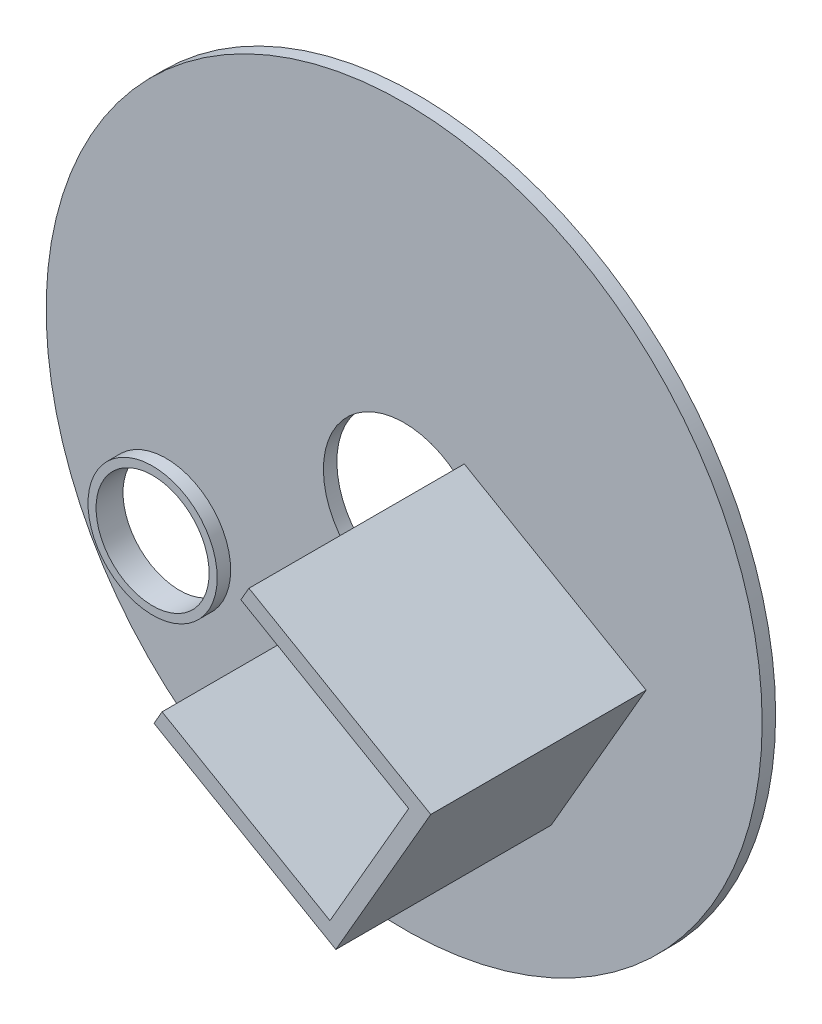
ISO-10303-21;
HEADER;
FILE_DESCRIPTION(('STEP AP214'),'2;1');
FILE_NAME('part.step','',(''),(''),'','','');
FILE_SCHEMA(('AUTOMOTIVE_DESIGN { 1 0 10303 214 1 1 1 1 }'));
ENDSEC;
DATA;
#1=APPLICATION_CONTEXT('core data for automotive mechanical design processes');
#2=APPLICATION_PROTOCOL_DEFINITION('international standard','automotive_design',2000,#1);
#3=PRODUCT_CONTEXT('',#1,'mechanical');
#4=PRODUCT('Part','Part','',(#3));
#5=PRODUCT_RELATED_PRODUCT_CATEGORY('part','',(#4));
#6=PRODUCT_DEFINITION_FORMATION('','',#4);
#7=PRODUCT_DEFINITION_CONTEXT('part definition',#1,'design');
#8=PRODUCT_DEFINITION('design','',#6,#7);
#9=PRODUCT_DEFINITION_SHAPE('','',#8);
#10=(LENGTH_UNIT() NAMED_UNIT(*) SI_UNIT(.MILLI.,.METRE.));
#11=(NAMED_UNIT(*) PLANE_ANGLE_UNIT() SI_UNIT($,.RADIAN.));
#12=(NAMED_UNIT(*) SI_UNIT($,.STERADIAN.) SOLID_ANGLE_UNIT());
#13=UNCERTAINTY_MEASURE_WITH_UNIT(LENGTH_MEASURE(1.E-05),#10,'distance_accuracy_value','');
#14=(GEOMETRIC_REPRESENTATION_CONTEXT(3) GLOBAL_UNCERTAINTY_ASSIGNED_CONTEXT((#13)) GLOBAL_UNIT_ASSIGNED_CONTEXT((#10,
#11,#12)) REPRESENTATION_CONTEXT('',''));
#15=CARTESIAN_POINT('',(0.,0.,0.));
#16=DIRECTION('',(0.,0.,1.));
#17=DIRECTION('',(1.,0.,0.));
#18=AXIS2_PLACEMENT_3D('',#15,#16,#17);
#19=CARTESIAN_POINT('',(0.,0.,2.5));
#20=DIRECTION('',(0.,0.,1.));
#21=DIRECTION('',(1.,0.,0.));
#22=AXIS2_PLACEMENT_3D('',#19,#20,#21);
#23=PLANE('',#22);
#24=DIRECTION('',(0.866025403784439,-0.5,0.));
#25=VECTOR('',#24,1.);
#26=CARTESIAN_POINT('',(7.3348934897823,12.7044081924091,2.5));
#27=LINE('',#26,#25);
#28=CARTESIAN_POINT('',(10.0456152535654,11.1393722523908,2.5));
#29=VERTEX_POINT('',#28);
#30=CARTESIAN_POINT('',(40.8448515283427,-6.64257510168673,2.5));
#31=VERTEX_POINT('',#30);
#32=EDGE_CURVE('E194',#29,#31,#27,.T.);
#33=ORIENTED_EDGE('',*,*,#32,.F.);
#34=CARTESIAN_POINT('',(0.,0.,2.5));
#35=DIRECTION('',(0.,0.,1.));
#36=DIRECTION('',(1.,0.,0.));
#37=AXIS2_PLACEMENT_3D('',#34,#35,#36);
#38=CIRCLE('',#37,15.);
#39=CARTESIAN_POINT('',(-4.32006711485053,-14.3644359486611,2.5));
#40=VERTEX_POINT('',#39);
#41=EDGE_CURVE('E215',#40,#29,#38,.T.);
#42=ORIENTED_EDGE('',*,*,#41,.F.);
#43=DIRECTION('',(-0.866025403784439,0.5,0.));
#44=VECTOR('',#43,1.);
#45=CARTESIAN_POINT('',(-7.30000000000009,-12.643970895253,2.5));
#46=LINE('',#45,#44);
#47=CARTESIAN_POINT('',(26.2099580385602,-31.9909541893488,2.5));
#48=VERTEX_POINT('',#47);
#49=EDGE_CURVE('E192',#48,#40,#46,.T.);
#50=ORIENTED_EDGE('',*,*,#49,.F.);
#51=DIRECTION('',(-0.500000000000004,-0.866025403784436,0.));
#52=VECTOR('',#51,1.);
#53=CARTESIAN_POINT('',(33.5099580385602,-19.3469832940961,2.5));
#54=LINE('',#53,#52);
#55=EDGE_CURVE('E202',#31,#48,#54,.T.);
#56=ORIENTED_EDGE('',*,*,#55,.F.);
#57=EDGE_LOOP('',(#33,#42,#50,#56));
#58=FACE_BOUND('',#57,.T.);
#59=ADVANCED_FACE('F34',(#58),#23,.T.);
#60=CARTESIAN_POINT('',(0.,0.,2.5));
#61=DIRECTION('',(0.,0.,-1.));
#62=DIRECTION('',(-1.,0.,0.));
#63=AXIS2_PLACEMENT_3D('',#60,#61,#62);
#64=CYLINDRICAL_SURFACE('',#63,15.);
#65=DIRECTION('',(0.,0.,-1.));
#66=VECTOR('',#65,1.);
#67=CARTESIAN_POINT('',(9.71109446483266,11.4321758338077,2.5));
#68=LINE('',#67,#66);
#69=CARTESIAN_POINT('',(9.71109446483266,11.4321758338077,2.5));
#70=VERTEX_POINT('',#69);
#71=CARTESIAN_POINT('',(9.71109446483266,11.4321758338077,0.));
#72=VERTEX_POINT('',#71);
#73=EDGE_CURVE('E11',#70,#72,#68,.T.);
#74=ORIENTED_EDGE('',*,*,#73,.F.);
#75=CARTESIAN_POINT('',(-5.04500746019167,-14.1261424219994,2.5));
#76=VERTEX_POINT('',#75);
#77=EDGE_CURVE('E218',#70,#76,#38,.T.);
#78=ORIENTED_EDGE('',*,*,#77,.T.);
#79=DIRECTION('',(0.,0.,-1.));
#80=VECTOR('',#79,1.);
#81=CARTESIAN_POINT('',(-5.04500746019167,-14.1261424219994,2.5));
#82=LINE('',#81,#80);
#83=CARTESIAN_POINT('',(-5.04500746019167,-14.1261424219994,0.));
#84=VERTEX_POINT('',#83);
#85=EDGE_CURVE('E225',#84,#76,#82,.F.);
#86=ORIENTED_EDGE('',*,*,#85,.F.);
#87=CARTESIAN_POINT('',(0.,0.,0.));
#88=DIRECTION('',(0.,0.,1.));
#89=DIRECTION('',(1.,0.,0.));
#90=AXIS2_PLACEMENT_3D('',#87,#88,#89);
#91=CIRCLE('',#90,15.);
#92=EDGE_CURVE('E219',#72,#84,#91,.T.);
#93=ORIENTED_EDGE('',*,*,#92,.F.);
#94=EDGE_LOOP('',(#74,#78,#86,#93));
#95=FACE_BOUND('',#94,.T.);
#96=ADVANCED_FACE('F267',(#95),#64,.F.);
#97=DIRECTION('',(-0.499999999999999,-0.866025403784439,0.));
#98=VECTOR('',#97,1.);
#99=CARTESIAN_POINT('',(2.33304350232051,-1.34698329409585,2.5));
#100=LINE('',#99,#98);
#101=CARTESIAN_POINT('',(11.1673369921028,13.9544618791821,2.5));
#102=VERTEX_POINT('',#101);
#103=EDGE_CURVE('E196',#102,#70,#100,.T.);
#104=ORIENTED_EDGE('',*,*,#103,.F.);
#105=DIRECTION('',(0.866025403784439,-0.5,0.));
#106=VECTOR('',#105,1.);
#107=CARTESIAN_POINT('',(8.8342934897823,15.3014451732779,2.5));
#108=LINE('',#107,#106);
#109=CARTESIAN_POINT('',(44.9412885092114,-5.54493812081795,2.5));
#110=VERTEX_POINT('',#109);
#111=EDGE_CURVE('E143',#102,#110,#108,.T.);
#112=ORIENTED_EDGE('',*,*,#111,.T.);
#113=DIRECTION('',(-0.5,-0.866025403784439,0.));
#114=VECTOR('',#113,1.);
#115=CARTESIAN_POINT('',(36.1069950194291,-20.8463832940959,2.5));
#116=LINE('',#115,#114);
#117=CARTESIAN_POINT('',(27.3075950194289,-36.0873911702176,2.5));
#118=VERTEX_POINT('',#117);
#119=EDGE_CURVE('E198',#110,#118,#116,.T.);
#120=ORIENTED_EDGE('',*,*,#119,.T.);
#121=DIRECTION('',(-0.866025403784439,0.5,0.));
#122=VECTOR('',#121,1.);
#123=CARTESIAN_POINT('',(-8.7994000000001,-15.2410078761217,2.5));
#124=LINE('',#123,#122);
#125=CARTESIAN_POINT('',(-6.4663564976796,-16.5879911702176,2.5));
#126=VERTEX_POINT('',#125);
#127=EDGE_CURVE('E57',#118,#126,#124,.T.);
#128=ORIENTED_EDGE('',*,*,#127,.T.);
#129=DIRECTION('',(-0.5,-0.866025403784438,0.));
#130=VECTOR('',#129,1.);
#131=CARTESIAN_POINT('',(2.3330435023205,-1.34698329409585,2.5));
#132=LINE('',#131,#130);
#133=EDGE_CURVE('E146',#76,#126,#132,.T.);
#134=ORIENTED_EDGE('',*,*,#133,.F.);
#135=ORIENTED_EDGE('',*,*,#77,.F.);
#136=EDGE_LOOP('',(#104,#112,#120,#128,#134,#135));
#137=FACE_BOUND('',#136,.T.);
#138=CARTESIAN_POINT('',(0.,0.,2.5));
#139=DIRECTION('',(0.,0.,1.));
#140=DIRECTION('',(1.,0.,0.));
#141=AXIS2_PLACEMENT_3D('',#138,#139,#140);
#142=CIRCLE('',#141,66.5);
#143=CARTESIAN_POINT('',(66.5,0.,2.5));
#144=VERTEX_POINT('',#143);
#145=EDGE_CURVE('E222',#144,#144,#142,.T.);
#146=ORIENTED_EDGE('',*,*,#145,.T.);
#147=EDGE_LOOP('',(#146));
#148=FACE_BOUND('',#147,.T.);
#149=CARTESIAN_POINT('',(-44.2268578187365,-24.8285231119721,2.5));
#150=DIRECTION('',(0.,0.,1.));
#151=DIRECTION('',(1.,0.,0.));
#152=AXIS2_PLACEMENT_3D('',#149,#150,#151);
#153=CIRCLE('',#152,12.);
#154=CARTESIAN_POINT('',(-32.2268578187365,-24.8285231119721,2.5));
#155=VERTEX_POINT('',#154);
#156=EDGE_CURVE('E208',#155,#155,#153,.T.);
#157=ORIENTED_EDGE('',*,*,#156,.F.);
#158=EDGE_LOOP('',(#157));
#159=FACE_BOUND('',#158,.T.);
#160=ADVANCED_FACE('F260',(#137,#148,#159),#23,.T.);
#161=CARTESIAN_POINT('',(0.,0.,0.));
#162=DIRECTION('',(0.,0.,1.));
#163=DIRECTION('',(1.,0.,0.));
#164=AXIS2_PLACEMENT_3D('',#161,#162,#163);
#165=PLANE('',#164);
#166=DIRECTION('',(0.499999999999999,0.866025403784439,0.));
#167=VECTOR('',#166,1.);
#168=CARTESIAN_POINT('',(9.6679369921028,11.3574248983133,0.));
#169=LINE('',#168,#167);
#170=CARTESIAN_POINT('',(9.6679369921028,11.3574248983133,0.));
#171=VERTEX_POINT('',#170);
#172=EDGE_CURVE('E169',#171,#72,#169,.T.);
#173=ORIENTED_EDGE('',*,*,#172,.T.);
#174=ORIENTED_EDGE('',*,*,#92,.T.);
#175=DIRECTION('',(0.5,0.866025403784438,0.));
#176=VECTOR('',#175,1.);
#177=CARTESIAN_POINT('',(-6.4663564976796,-16.5879911702176,0.));
#178=LINE('',#177,#176);
#179=CARTESIAN_POINT('',(-4.9669564976796,-13.9909541893488,0.));
#180=VERTEX_POINT('',#179);
#181=EDGE_CURVE('E137',#84,#180,#178,.T.);
#182=ORIENTED_EDGE('',*,*,#181,.T.);
#183=DIRECTION('',(0.866025403784439,-0.5,0.));
#184=VECTOR('',#183,1.);
#185=CARTESIAN_POINT('',(26.2099580385602,-31.9909541893488,0.));
#186=LINE('',#185,#184);
#187=CARTESIAN_POINT('',(-4.32006711485051,-14.3644359486611,0.));
#188=VERTEX_POINT('',#187);
#189=EDGE_CURVE('E49',#180,#188,#186,.T.);
#190=ORIENTED_EDGE('',*,*,#189,.T.);
#191=CARTESIAN_POINT('',(10.0456152535654,11.1393722523908,0.));
#192=VERTEX_POINT('',#191);
#193=EDGE_CURVE('E220',#188,#192,#91,.T.);
#194=ORIENTED_EDGE('',*,*,#193,.T.);
#195=DIRECTION('',(-0.866025403784439,0.5,0.));
#196=VECTOR('',#195,1.);
#197=CARTESIAN_POINT('',(40.8448515283427,-6.64257510168673,0.));
#198=LINE('',#197,#196);
#199=EDGE_CURVE('E172',#192,#171,#198,.T.);
#200=ORIENTED_EDGE('',*,*,#199,.T.);
#201=EDGE_LOOP('',(#173,#174,#182,#190,#194,#200));
#202=FACE_BOUND('',#201,.T.);
#203=CARTESIAN_POINT('',(-44.2268578187365,-24.8285231119721,0.));
#204=DIRECTION('',(0.,0.,1.));
#205=DIRECTION('',(1.,0.,0.));
#206=AXIS2_PLACEMENT_3D('',#203,#204,#205);
#207=CIRCLE('',#206,10.5);
#208=CARTESIAN_POINT('',(-33.7268578187365,-24.8285231119721,0.));
#209=VERTEX_POINT('',#208);
#210=EDGE_CURVE('E212',#209,#209,#207,.T.);
#211=ORIENTED_EDGE('',*,*,#210,.T.);
#212=EDGE_LOOP('',(#211));
#213=FACE_BOUND('',#212,.T.);
#214=CARTESIAN_POINT('',(0.,0.,0.));
#215=DIRECTION('',(0.,0.,1.));
#216=DIRECTION('',(1.,0.,0.));
#217=AXIS2_PLACEMENT_3D('',#214,#215,#216);
#218=CIRCLE('',#217,66.5);
#219=CARTESIAN_POINT('',(66.5,0.,0.));
#220=VERTEX_POINT('',#219);
#221=EDGE_CURVE('E226',#220,#220,#218,.T.);
#222=ORIENTED_EDGE('',*,*,#221,.F.);
#223=EDGE_LOOP('',(#222));
#224=FACE_BOUND('',#223,.T.);
#225=ADVANCED_FACE('F270',(#202,#213,#224),#165,.F.);
#226=CARTESIAN_POINT('',(0.,0.,2.5));
#227=DIRECTION('',(0.,0.,-1.));
#228=DIRECTION('',(-1.,0.,0.));
#229=AXIS2_PLACEMENT_3D('',#226,#227,#228);
#230=CYLINDRICAL_SURFACE('',#229,66.5);
#231=ORIENTED_EDGE('',*,*,#145,.F.);
#232=EDGE_LOOP('',(#231));
#233=FACE_BOUND('',#232,.T.);
#234=ORIENTED_EDGE('',*,*,#221,.T.);
#235=EDGE_LOOP('',(#234));
#236=FACE_BOUND('',#235,.T.);
#237=ADVANCED_FACE('F36',(#233,#236),#230,.T.);
#238=DIRECTION('',(0.,0.,-1.));
#239=VECTOR('',#238,1.);
#240=CARTESIAN_POINT('',(10.0456152535654,11.1393722523908,2.5));
#241=LINE('',#240,#239);
#242=EDGE_CURVE('E42',#192,#29,#241,.F.);
#243=ORIENTED_EDGE('',*,*,#242,.F.);
#244=ORIENTED_EDGE('',*,*,#193,.F.);
#245=DIRECTION('',(0.,0.,-1.));
#246=VECTOR('',#245,1.);
#247=CARTESIAN_POINT('',(-4.32006711485053,-14.3644359486611,2.5));
#248=LINE('',#247,#246);
#249=EDGE_CURVE('E232',#40,#188,#248,.T.);
#250=ORIENTED_EDGE('',*,*,#249,.F.);
#251=ORIENTED_EDGE('',*,*,#41,.T.);
#252=EDGE_LOOP('',(#243,#244,#250,#251));
#253=FACE_BOUND('',#252,.T.);
#254=ADVANCED_FACE('F244',(#253),#64,.F.);
#255=CARTESIAN_POINT('',(-44.2268578187365,-24.8285231119721,-11.));
#256=DIRECTION('',(0.,0.,1.));
#257=DIRECTION('',(1.,0.,0.));
#258=AXIS2_PLACEMENT_3D('',#255,#256,#257);
#259=CYLINDRICAL_SURFACE('',#258,10.5);
#260=ORIENTED_EDGE('',*,*,#210,.F.);
#261=EDGE_LOOP('',(#260));
#262=FACE_BOUND('',#261,.T.);
#263=CARTESIAN_POINT('',(-44.2268578187365,-24.8285231119721,5.));
#264=DIRECTION('',(0.,0.,1.));
#265=DIRECTION('',(1.,0.,0.));
#266=AXIS2_PLACEMENT_3D('',#263,#264,#265);
#267=CIRCLE('',#266,10.5);
#268=CARTESIAN_POINT('',(-33.7268578187365,-24.8285231119721,5.));
#269=VERTEX_POINT('',#268);
#270=EDGE_CURVE('E205',#269,#269,#267,.T.);
#271=ORIENTED_EDGE('',*,*,#270,.T.);
#272=EDGE_LOOP('',(#271));
#273=FACE_BOUND('',#272,.T.);
#274=ADVANCED_FACE('F282',(#262,#273),#259,.F.);
#275=CARTESIAN_POINT('',(-44.2268578187365,-24.8285231119721,5.));
#276=DIRECTION('',(0.,0.,1.));
#277=DIRECTION('',(1.,0.,0.));
#278=AXIS2_PLACEMENT_3D('',#275,#276,#277);
#279=PLANE('',#278);
#280=CARTESIAN_POINT('',(-44.2268578187365,-24.8285231119721,5.));
#281=DIRECTION('',(0.,0.,1.));
#282=DIRECTION('',(1.,0.,0.));
#283=AXIS2_PLACEMENT_3D('',#280,#281,#282);
#284=CIRCLE('',#283,12.);
#285=CARTESIAN_POINT('',(-32.2268578187365,-24.8285231119721,5.));
#286=VERTEX_POINT('',#285);
#287=EDGE_CURVE('E209',#286,#286,#284,.T.);
#288=ORIENTED_EDGE('',*,*,#287,.T.);
#289=EDGE_LOOP('',(#288));
#290=FACE_BOUND('',#289,.T.);
#291=ORIENTED_EDGE('',*,*,#270,.F.);
#292=EDGE_LOOP('',(#291));
#293=FACE_BOUND('',#292,.T.);
#294=ADVANCED_FACE('F391',(#290,#293),#279,.T.);
#295=CARTESIAN_POINT('',(-44.2268578187365,-24.8285231119721,5.));
#296=DIRECTION('',(0.,0.,-1.));
#297=DIRECTION('',(-1.,0.,0.));
#298=AXIS2_PLACEMENT_3D('',#295,#296,#297);
#299=CYLINDRICAL_SURFACE('',#298,12.);
#300=ORIENTED_EDGE('',*,*,#287,.F.);
#301=EDGE_LOOP('',(#300));
#302=FACE_BOUND('',#301,.T.);
#303=ORIENTED_EDGE('',*,*,#156,.T.);
#304=EDGE_LOOP('',(#303));
#305=FACE_BOUND('',#304,.T.);
#306=ADVANCED_FACE('F319',(#302,#305),#299,.T.);
#307=CARTESIAN_POINT('',(42.3442515283426,-4.04553812081795,42.5));
#308=DIRECTION('',(-0.5,-0.866025403784439,0.));
#309=DIRECTION('',(0.866025403784439,-0.5,0.));
#310=AXIS2_PLACEMENT_3D('',#307,#308,#309);
#311=PLANE('',#310);
#312=ORIENTED_EDGE('',*,*,#111,.F.);
#313=DIRECTION('',(0.,0.,-1.));
#314=VECTOR('',#313,1.);
#315=CARTESIAN_POINT('',(11.1673369921028,13.9544618791821,42.5));
#316=LINE('',#315,#314);
#317=CARTESIAN_POINT('',(11.1673369921028,13.9544618791821,42.5));
#318=VERTEX_POINT('',#317);
#319=EDGE_CURVE('E140',#318,#102,#316,.T.);
#320=ORIENTED_EDGE('',*,*,#319,.F.);
#321=DIRECTION('',(-0.866025403784439,0.5,0.));
#322=VECTOR('',#321,1.);
#323=CARTESIAN_POINT('',(42.3442515283426,-4.04553812081795,42.5));
#324=LINE('',#323,#322);
#325=CARTESIAN_POINT('',(44.9412885092114,-5.54493812081795,42.5));
#326=VERTEX_POINT('',#325);
#327=EDGE_CURVE('E125',#326,#318,#324,.T.);
#328=ORIENTED_EDGE('',*,*,#327,.F.);
#329=DIRECTION('',(0.,0.,-1.));
#330=VECTOR('',#329,1.);
#331=CARTESIAN_POINT('',(44.9412885092114,-5.54493812081795,42.5));
#332=LINE('',#331,#330);
#333=EDGE_CURVE('E168',#326,#110,#332,.T.);
#334=ORIENTED_EDGE('',*,*,#333,.T.);
#335=EDGE_LOOP('',(#312,#320,#328,#334));
#336=FACE_BOUND('',#335,.T.);
#337=ADVANCED_FACE('F141',(#336),#311,.F.);
#338=CARTESIAN_POINT('',(9.6679369921028,11.3574248983133,42.5));
#339=DIRECTION('',(-0.866025403784439,0.499999999999999,0.));
#340=DIRECTION('',(-0.499999999999999,-0.866025403784439,0.));
#341=AXIS2_PLACEMENT_3D('',#338,#339,#340);
#342=PLANE('',#341);
#343=ORIENTED_EDGE('',*,*,#319,.T.);
#344=ORIENTED_EDGE('',*,*,#103,.T.);
#345=ORIENTED_EDGE('',*,*,#73,.T.);
#346=ORIENTED_EDGE('',*,*,#172,.F.);
#347=DIRECTION('',(0.,0.,-1.));
#348=VECTOR('',#347,1.);
#349=CARTESIAN_POINT('',(9.6679369921028,11.3574248983133,42.5));
#350=LINE('',#349,#348);
#351=CARTESIAN_POINT('',(9.6679369921028,11.3574248983133,42.5));
#352=VERTEX_POINT('',#351);
#353=EDGE_CURVE('E147',#352,#171,#350,.T.);
#354=ORIENTED_EDGE('',*,*,#353,.F.);
#355=DIRECTION('',(0.499999999999999,0.866025403784439,0.));
#356=VECTOR('',#355,1.);
#357=CARTESIAN_POINT('',(9.6679369921028,11.3574248983133,42.5));
#358=LINE('',#357,#356);
#359=EDGE_CURVE('E130',#352,#318,#358,.T.);
#360=ORIENTED_EDGE('',*,*,#359,.T.);
#361=EDGE_LOOP('',(#343,#344,#345,#346,#354,#360));
#362=FACE_BOUND('',#361,.T.);
#363=ADVANCED_FACE('F149',(#362),#342,.T.);
#364=CARTESIAN_POINT('',(40.8448515283427,-6.64257510168673,42.5));
#365=DIRECTION('',(-0.5,-0.866025403784439,0.));
#366=DIRECTION('',(0.866025403784439,-0.5,0.));
#367=AXIS2_PLACEMENT_3D('',#364,#365,#366);
#368=PLANE('',#367);
#369=ORIENTED_EDGE('',*,*,#242,.T.);
#370=ORIENTED_EDGE('',*,*,#32,.T.);
#371=DIRECTION('',(0.,0.,-1.));
#372=VECTOR('',#371,1.);
#373=CARTESIAN_POINT('',(40.8448515283427,-6.64257510168673,42.5));
#374=LINE('',#373,#372);
#375=CARTESIAN_POINT('',(40.8448515283427,-6.64257510168673,42.5));
#376=VERTEX_POINT('',#375);
#377=EDGE_CURVE('E187',#376,#31,#374,.T.);
#378=ORIENTED_EDGE('',*,*,#377,.F.);
#379=DIRECTION('',(-0.866025403784439,0.5,0.));
#380=VECTOR('',#379,1.);
#381=CARTESIAN_POINT('',(40.8448515283427,-6.64257510168673,42.5));
#382=LINE('',#381,#380);
#383=EDGE_CURVE('E152',#376,#352,#382,.T.);
#384=ORIENTED_EDGE('',*,*,#383,.T.);
#385=ORIENTED_EDGE('',*,*,#353,.T.);
#386=ORIENTED_EDGE('',*,*,#199,.F.);
#387=EDGE_LOOP('',(#369,#370,#378,#384,#385,#386));
#388=FACE_BOUND('',#387,.T.);
#389=ADVANCED_FACE('F236',(#388),#368,.T.);
#390=CARTESIAN_POINT('',(33.5099580385603,-19.346983294096,42.5));
#391=DIRECTION('',(-0.866025403784436,0.500000000000004,0.));
#392=DIRECTION('',(-0.500000000000004,-0.866025403784436,0.));
#393=AXIS2_PLACEMENT_3D('',#390,#391,#392);
#394=PLANE('',#393);
#395=ORIENTED_EDGE('',*,*,#377,.T.);
#396=ORIENTED_EDGE('',*,*,#55,.T.);
#397=DIRECTION('',(0.,0.,-1.));
#398=VECTOR('',#397,1.);
#399=CARTESIAN_POINT('',(26.2099580385602,-31.9909541893488,42.5));
#400=LINE('',#399,#398);
#401=CARTESIAN_POINT('',(26.2099580385602,-31.9909541893488,42.5));
#402=VERTEX_POINT('',#401);
#403=EDGE_CURVE('E184',#402,#48,#400,.T.);
#404=ORIENTED_EDGE('',*,*,#403,.F.);
#405=DIRECTION('',(0.5,0.866025403784439,0.));
#406=VECTOR('',#405,1.);
#407=CARTESIAN_POINT('',(33.5099580385603,-19.346983294096,42.5));
#408=LINE('',#407,#406);
#409=EDGE_CURVE('E154',#402,#376,#408,.T.);
#410=ORIENTED_EDGE('',*,*,#409,.T.);
#411=EDGE_LOOP('',(#395,#396,#404,#410));
#412=FACE_BOUND('',#411,.T.);
#413=ADVANCED_FACE('F250',(#412),#394,.T.);
#414=CARTESIAN_POINT('',(26.2099580385602,-31.9909541893488,42.5));
#415=DIRECTION('',(0.5,0.866025403784439,0.));
#416=DIRECTION('',(-0.866025403784439,0.5,0.));
#417=AXIS2_PLACEMENT_3D('',#414,#415,#416);
#418=PLANE('',#417);
#419=ORIENTED_EDGE('',*,*,#403,.T.);
#420=ORIENTED_EDGE('',*,*,#49,.T.);
#421=ORIENTED_EDGE('',*,*,#249,.T.);
#422=ORIENTED_EDGE('',*,*,#189,.F.);
#423=DIRECTION('',(0.,0.,-1.));
#424=VECTOR('',#423,1.);
#425=CARTESIAN_POINT('',(-4.9669564976796,-13.9909541893488,42.5));
#426=LINE('',#425,#424);
#427=CARTESIAN_POINT('',(-4.9669564976796,-13.9909541893488,42.5));
#428=VERTEX_POINT('',#427);
#429=EDGE_CURVE('E181',#428,#180,#426,.T.);
#430=ORIENTED_EDGE('',*,*,#429,.F.);
#431=DIRECTION('',(0.866025403784439,-0.5,0.));
#432=VECTOR('',#431,1.);
#433=CARTESIAN_POINT('',(26.2099580385602,-31.9909541893488,42.5));
#434=LINE('',#433,#432);
#435=EDGE_CURVE('E159',#428,#402,#434,.T.);
#436=ORIENTED_EDGE('',*,*,#435,.T.);
#437=EDGE_LOOP('',(#419,#420,#421,#422,#430,#436));
#438=FACE_BOUND('',#437,.T.);
#439=ADVANCED_FACE('F246',(#438),#418,.T.);
#440=CARTESIAN_POINT('',(-6.4663564976796,-16.5879911702176,42.5));
#441=DIRECTION('',(-0.866025403784438,0.5,0.));
#442=DIRECTION('',(-0.5,-0.866025403784438,0.));
#443=AXIS2_PLACEMENT_3D('',#440,#441,#442);
#444=PLANE('',#443);
#445=ORIENTED_EDGE('',*,*,#85,.T.);
#446=ORIENTED_EDGE('',*,*,#133,.T.);
#447=DIRECTION('',(0.,0.,-1.));
#448=VECTOR('',#447,1.);
#449=CARTESIAN_POINT('',(-6.4663564976796,-16.5879911702176,42.5));
#450=LINE('',#449,#448);
#451=CARTESIAN_POINT('',(-6.4663564976796,-16.5879911702176,42.5));
#452=VERTEX_POINT('',#451);
#453=EDGE_CURVE('E179',#452,#126,#450,.T.);
#454=ORIENTED_EDGE('',*,*,#453,.F.);
#455=DIRECTION('',(0.5,0.866025403784438,0.));
#456=VECTOR('',#455,1.);
#457=CARTESIAN_POINT('',(-6.4663564976796,-16.5879911702176,42.5));
#458=LINE('',#457,#456);
#459=EDGE_CURVE('E162',#452,#428,#458,.T.);
#460=ORIENTED_EDGE('',*,*,#459,.T.);
#461=ORIENTED_EDGE('',*,*,#429,.T.);
#462=ORIENTED_EDGE('',*,*,#181,.F.);
#463=EDGE_LOOP('',(#445,#446,#454,#460,#461,#462));
#464=FACE_BOUND('',#463,.T.);
#465=ADVANCED_FACE('F253',(#464),#444,.T.);
#466=CARTESIAN_POINT('',(24.7105580385602,-34.5879911702176,42.5));
#467=DIRECTION('',(0.5,0.866025403784439,0.));
#468=DIRECTION('',(-0.866025403784439,0.5,0.));
#469=AXIS2_PLACEMENT_3D('',#466,#467,#468);
#470=PLANE('',#469);
#471=ORIENTED_EDGE('',*,*,#127,.F.);
#472=DIRECTION('',(0.,0.,-1.));
#473=VECTOR('',#472,1.);
#474=CARTESIAN_POINT('',(27.3075950194289,-36.0873911702176,42.5));
#475=LINE('',#474,#473);
#476=CARTESIAN_POINT('',(27.3075950194289,-36.0873911702176,42.5));
#477=VERTEX_POINT('',#476);
#478=EDGE_CURVE('E177',#477,#118,#475,.T.);
#479=ORIENTED_EDGE('',*,*,#478,.F.);
#480=DIRECTION('',(0.866025403784439,-0.5,0.));
#481=VECTOR('',#480,1.);
#482=CARTESIAN_POINT('',(24.7105580385602,-34.5879911702176,42.5));
#483=LINE('',#482,#481);
#484=EDGE_CURVE('E165',#452,#477,#483,.T.);
#485=ORIENTED_EDGE('',*,*,#484,.F.);
#486=ORIENTED_EDGE('',*,*,#453,.T.);
#487=EDGE_LOOP('',(#471,#479,#485,#486));
#488=FACE_BOUND('',#487,.T.);
#489=ADVANCED_FACE('F256',(#488),#470,.F.);
#490=CARTESIAN_POINT('',(36.106995019429,-20.846383294096,42.5));
#491=DIRECTION('',(-0.866025403784439,0.5,0.));
#492=DIRECTION('',(-0.5,-0.866025403784439,0.));
#493=AXIS2_PLACEMENT_3D('',#490,#491,#492);
#494=PLANE('',#493);
#495=ORIENTED_EDGE('',*,*,#119,.F.);
#496=ORIENTED_EDGE('',*,*,#333,.F.);
#497=DIRECTION('',(0.500000000000004,0.866025403784436,0.));
#498=VECTOR('',#497,1.);
#499=CARTESIAN_POINT('',(36.106995019429,-20.8463832940961,42.5));
#500=LINE('',#499,#498);
#501=EDGE_CURVE('E133',#477,#326,#500,.T.);
#502=ORIENTED_EDGE('',*,*,#501,.F.);
#503=ORIENTED_EDGE('',*,*,#478,.T.);
#504=EDGE_LOOP('',(#495,#496,#502,#503));
#505=FACE_BOUND('',#504,.T.);
#506=ADVANCED_FACE('F258',(#505),#494,.F.);
#507=CARTESIAN_POINT('',(0.,0.,42.5));
#508=DIRECTION('',(0.,0.,-1.));
#509=DIRECTION('',(-1.,0.,0.));
#510=AXIS2_PLACEMENT_3D('',#507,#508,#509);
#511=PLANE('',#510);
#512=ORIENTED_EDGE('',*,*,#327,.T.);
#513=ORIENTED_EDGE('',*,*,#359,.F.);
#514=ORIENTED_EDGE('',*,*,#383,.F.);
#515=ORIENTED_EDGE('',*,*,#409,.F.);
#516=ORIENTED_EDGE('',*,*,#435,.F.);
#517=ORIENTED_EDGE('',*,*,#459,.F.);
#518=ORIENTED_EDGE('',*,*,#484,.T.);
#519=ORIENTED_EDGE('',*,*,#501,.T.);
#520=EDGE_LOOP('',(#512,#513,#514,#515,#516,#517,#518,#519));
#521=FACE_BOUND('',#520,.T.);
#522=ADVANCED_FACE('F127',(#521),#511,.F.);
#523=CLOSED_SHELL('',(#59,#96,#160,#225,#237,#254,#274,#294,#306,#337,#363,#389,#413,#439,#465,
#489,#506,#522));
#524=MANIFOLD_SOLID_BREP('B2',#523);
#525=ADVANCED_BREP_SHAPE_REPRESENTATION('',(#18,#524),#14);
#526=SHAPE_DEFINITION_REPRESENTATION(#9,#525);
ENDSEC;
END-ISO-10303-21;
